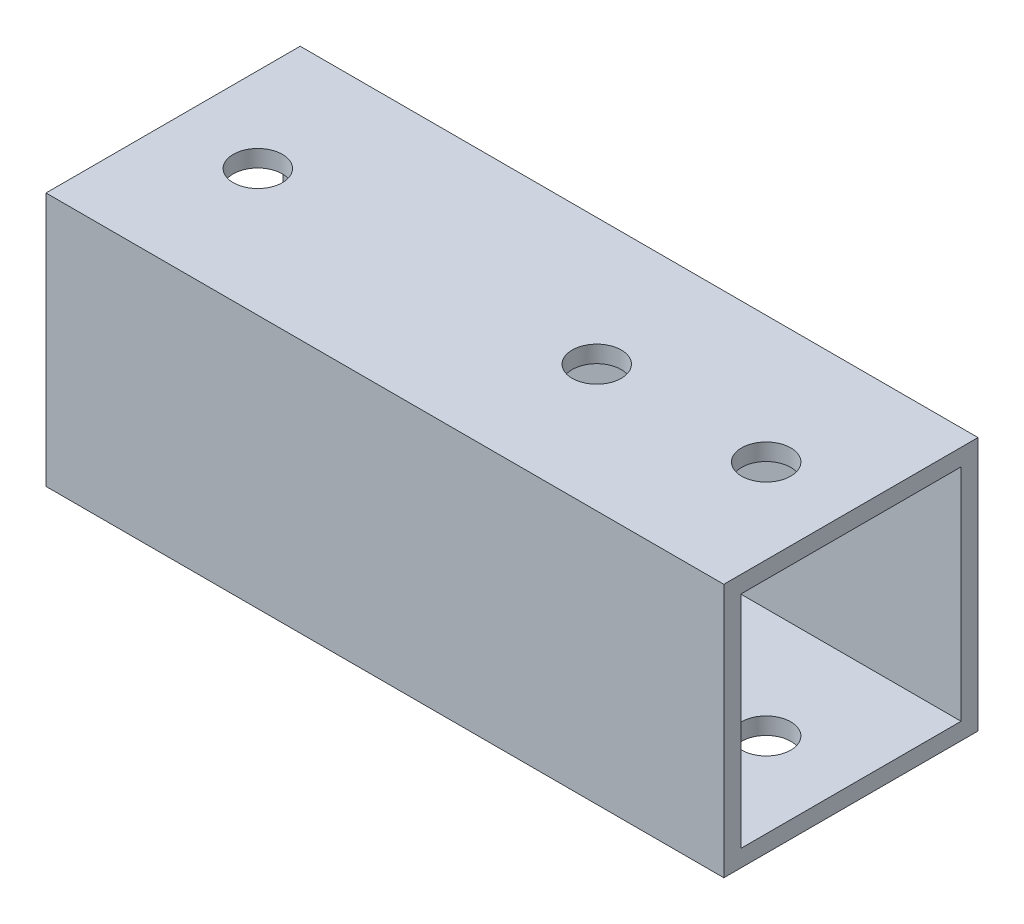
ISO-10303-21;
HEADER;
FILE_DESCRIPTION(('STEP AP214'),'2;1');
FILE_NAME('part.step','',(''),(''),'','','');
FILE_SCHEMA(('AUTOMOTIVE_DESIGN { 1 0 10303 214 1 1 1 1 }'));
ENDSEC;
DATA;
#1=APPLICATION_CONTEXT('core data for automotive mechanical design processes');
#2=APPLICATION_PROTOCOL_DEFINITION('international standard','automotive_design',2000,#1);
#3=PRODUCT_CONTEXT('',#1,'mechanical');
#4=PRODUCT('Part','Part','',(#3));
#5=PRODUCT_RELATED_PRODUCT_CATEGORY('part','',(#4));
#6=PRODUCT_DEFINITION_FORMATION('','',#4);
#7=PRODUCT_DEFINITION_CONTEXT('part definition',#1,'design');
#8=PRODUCT_DEFINITION('design','',#6,#7);
#9=PRODUCT_DEFINITION_SHAPE('','',#8);
#10=(LENGTH_UNIT() NAMED_UNIT(*) SI_UNIT(.MILLI.,.METRE.));
#11=(NAMED_UNIT(*) PLANE_ANGLE_UNIT() SI_UNIT($,.RADIAN.));
#12=(NAMED_UNIT(*) SI_UNIT($,.STERADIAN.) SOLID_ANGLE_UNIT());
#13=UNCERTAINTY_MEASURE_WITH_UNIT(LENGTH_MEASURE(1.E-05),#10,'distance_accuracy_value','');
#14=(GEOMETRIC_REPRESENTATION_CONTEXT(3) GLOBAL_UNCERTAINTY_ASSIGNED_CONTEXT((#13)) GLOBAL_UNIT_ASSIGNED_CONTEXT((#10,
#11,#12)) REPRESENTATION_CONTEXT('',''));
#15=CARTESIAN_POINT('',(0.,0.,0.));
#16=DIRECTION('',(0.,0.,1.));
#17=DIRECTION('',(1.,0.,0.));
#18=AXIS2_PLACEMENT_3D('',#15,#16,#17);
#19=CARTESIAN_POINT('',(40.,0.,0.));
#20=DIRECTION('',(-1.,0.,0.));
#21=DIRECTION('',(0.,0.,1.));
#22=AXIS2_PLACEMENT_3D('',#19,#20,#21);
#23=PLANE('',#22);
#24=DIRECTION('',(0.,1.,0.));
#25=VECTOR('',#24,1.);
#26=CARTESIAN_POINT('',(40.,-7.5,-7.5));
#27=LINE('',#26,#25);
#28=CARTESIAN_POINT('',(40.,-7.5,-7.5));
#29=VERTEX_POINT('',#28);
#30=CARTESIAN_POINT('',(40.,7.5,-7.5));
#31=VERTEX_POINT('',#30);
#32=EDGE_CURVE('E146',#29,#31,#27,.T.);
#33=ORIENTED_EDGE('',*,*,#32,.T.);
#34=DIRECTION('',(0.,0.,1.));
#35=VECTOR('',#34,1.);
#36=CARTESIAN_POINT('',(40.,7.5,7.5));
#37=LINE('',#36,#35);
#38=CARTESIAN_POINT('',(40.,7.5,7.5));
#39=VERTEX_POINT('',#38);
#40=EDGE_CURVE('E149',#31,#39,#37,.T.);
#41=ORIENTED_EDGE('',*,*,#40,.T.);
#42=DIRECTION('',(0.,-1.,0.));
#43=VECTOR('',#42,1.);
#44=CARTESIAN_POINT('',(40.,-7.5,7.5));
#45=LINE('',#44,#43);
#46=CARTESIAN_POINT('',(40.,-7.5,7.5));
#47=VERTEX_POINT('',#46);
#48=EDGE_CURVE('E152',#39,#47,#45,.T.);
#49=ORIENTED_EDGE('',*,*,#48,.T.);
#50=DIRECTION('',(0.,0.,-1.));
#51=VECTOR('',#50,1.);
#52=CARTESIAN_POINT('',(40.,-7.5,7.5));
#53=LINE('',#52,#51);
#54=EDGE_CURVE('E154',#47,#29,#53,.T.);
#55=ORIENTED_EDGE('',*,*,#54,.T.);
#56=EDGE_LOOP('',(#33,#41,#49,#55));
#57=FACE_BOUND('',#56,.T.);
#58=DIRECTION('',(0.,0.,-1.));
#59=VECTOR('',#58,1.);
#60=CARTESIAN_POINT('',(40.,-6.5,6.5));
#61=LINE('',#60,#59);
#62=CARTESIAN_POINT('',(40.,-6.5,6.5));
#63=VERTEX_POINT('',#62);
#64=CARTESIAN_POINT('',(40.,-6.5,-6.5));
#65=VERTEX_POINT('',#64);
#66=EDGE_CURVE('E108',#63,#65,#61,.T.);
#67=ORIENTED_EDGE('',*,*,#66,.F.);
#68=DIRECTION('',(0.,-1.,0.));
#69=VECTOR('',#68,1.);
#70=CARTESIAN_POINT('',(40.,-6.5,6.5));
#71=LINE('',#70,#69);
#72=CARTESIAN_POINT('',(40.,6.5,6.5));
#73=VERTEX_POINT('',#72);
#74=EDGE_CURVE('E130',#73,#63,#71,.T.);
#75=ORIENTED_EDGE('',*,*,#74,.F.);
#76=DIRECTION('',(0.,0.,1.));
#77=VECTOR('',#76,1.);
#78=CARTESIAN_POINT('',(40.,6.5,6.5));
#79=LINE('',#78,#77);
#80=CARTESIAN_POINT('',(40.,6.5,-6.5));
#81=VERTEX_POINT('',#80);
#82=EDGE_CURVE('E128',#81,#73,#79,.T.);
#83=ORIENTED_EDGE('',*,*,#82,.F.);
#84=DIRECTION('',(0.,1.,0.));
#85=VECTOR('',#84,1.);
#86=CARTESIAN_POINT('',(40.,-6.5,-6.5));
#87=LINE('',#86,#85);
#88=EDGE_CURVE('E116',#65,#81,#87,.T.);
#89=ORIENTED_EDGE('',*,*,#88,.F.);
#90=EDGE_LOOP('',(#67,#75,#83,#89));
#91=FACE_BOUND('',#90,.T.);
#92=ADVANCED_FACE('F41',(#57,#91),#23,.F.);
#93=CARTESIAN_POINT('',(0.,0.,0.));
#94=DIRECTION('',(-1.,0.,0.));
#95=DIRECTION('',(0.,0.,1.));
#96=AXIS2_PLACEMENT_3D('',#93,#94,#95);
#97=PLANE('',#96);
#98=DIRECTION('',(0.,1.,0.));
#99=VECTOR('',#98,1.);
#100=CARTESIAN_POINT('',(0.,-7.5,-7.5));
#101=LINE('',#100,#99);
#102=CARTESIAN_POINT('',(0.,-7.5,-7.5));
#103=VERTEX_POINT('',#102);
#104=CARTESIAN_POINT('',(0.,7.5,-7.5));
#105=VERTEX_POINT('',#104);
#106=EDGE_CURVE('E124',#103,#105,#101,.T.);
#107=ORIENTED_EDGE('',*,*,#106,.F.);
#108=DIRECTION('',(0.,0.,-1.));
#109=VECTOR('',#108,1.);
#110=CARTESIAN_POINT('',(0.,-7.5,7.5));
#111=LINE('',#110,#109);
#112=CARTESIAN_POINT('',(0.,-7.5,7.5));
#113=VERTEX_POINT('',#112);
#114=EDGE_CURVE('E150',#113,#103,#111,.T.);
#115=ORIENTED_EDGE('',*,*,#114,.F.);
#116=DIRECTION('',(0.,-1.,0.));
#117=VECTOR('',#116,1.);
#118=CARTESIAN_POINT('',(0.,-7.5,7.5));
#119=LINE('',#118,#117);
#120=CARTESIAN_POINT('',(0.,7.5,7.5));
#121=VERTEX_POINT('',#120);
#122=EDGE_CURVE('E161',#121,#113,#119,.T.);
#123=ORIENTED_EDGE('',*,*,#122,.F.);
#124=DIRECTION('',(0.,0.,1.));
#125=VECTOR('',#124,1.);
#126=CARTESIAN_POINT('',(0.,7.5,7.5));
#127=LINE('',#126,#125);
#128=EDGE_CURVE('E159',#105,#121,#127,.T.);
#129=ORIENTED_EDGE('',*,*,#128,.F.);
#130=EDGE_LOOP('',(#107,#115,#123,#129));
#131=FACE_BOUND('',#130,.T.);
#132=DIRECTION('',(0.,-1.,0.));
#133=VECTOR('',#132,1.);
#134=CARTESIAN_POINT('',(0.,-6.5,6.5));
#135=LINE('',#134,#133);
#136=CARTESIAN_POINT('',(0.,6.5,6.5));
#137=VERTEX_POINT('',#136);
#138=CARTESIAN_POINT('',(0.,-6.5,6.5));
#139=VERTEX_POINT('',#138);
#140=EDGE_CURVE('E117',#137,#139,#135,.T.);
#141=ORIENTED_EDGE('',*,*,#140,.T.);
#142=DIRECTION('',(0.,0.,-1.));
#143=VECTOR('',#142,1.);
#144=CARTESIAN_POINT('',(0.,-6.5,6.5));
#145=LINE('',#144,#143);
#146=CARTESIAN_POINT('',(0.,-6.5,-6.5));
#147=VERTEX_POINT('',#146);
#148=EDGE_CURVE('E66',#139,#147,#145,.T.);
#149=ORIENTED_EDGE('',*,*,#148,.T.);
#150=DIRECTION('',(0.,1.,0.));
#151=VECTOR('',#150,1.);
#152=CARTESIAN_POINT('',(0.,-6.5,-6.5));
#153=LINE('',#152,#151);
#154=CARTESIAN_POINT('',(0.,6.5,-6.5));
#155=VERTEX_POINT('',#154);
#156=EDGE_CURVE('E123',#147,#155,#153,.T.);
#157=ORIENTED_EDGE('',*,*,#156,.T.);
#158=DIRECTION('',(0.,0.,1.));
#159=VECTOR('',#158,1.);
#160=CARTESIAN_POINT('',(0.,6.5,6.5));
#161=LINE('',#160,#159);
#162=EDGE_CURVE('E138',#155,#137,#161,.T.);
#163=ORIENTED_EDGE('',*,*,#162,.T.);
#164=EDGE_LOOP('',(#141,#149,#157,#163));
#165=FACE_BOUND('',#164,.T.);
#166=ADVANCED_FACE('F208',(#131,#165),#97,.T.);
#167=CARTESIAN_POINT('',(40.,-7.5,-7.5));
#168=DIRECTION('',(0.,0.,1.));
#169=DIRECTION('',(1.,0.,0.));
#170=AXIS2_PLACEMENT_3D('',#167,#168,#169);
#171=PLANE('',#170);
#172=ORIENTED_EDGE('',*,*,#106,.T.);
#173=DIRECTION('',(-1.,0.,0.));
#174=VECTOR('',#173,1.);
#175=CARTESIAN_POINT('',(40.,7.5,-7.5));
#176=LINE('',#175,#174);
#177=EDGE_CURVE('E11',#31,#105,#176,.T.);
#178=ORIENTED_EDGE('',*,*,#177,.F.);
#179=ORIENTED_EDGE('',*,*,#32,.F.);
#180=DIRECTION('',(-1.,0.,0.));
#181=VECTOR('',#180,1.);
#182=CARTESIAN_POINT('',(40.,-7.5,-7.5));
#183=LINE('',#182,#181);
#184=EDGE_CURVE('E156',#29,#103,#183,.T.);
#185=ORIENTED_EDGE('',*,*,#184,.T.);
#186=EDGE_LOOP('',(#172,#178,#179,#185));
#187=FACE_BOUND('',#186,.T.);
#188=ADVANCED_FACE('F43',(#187),#171,.F.);
#189=CARTESIAN_POINT('',(40.,7.5,7.5));
#190=DIRECTION('',(0.,-1.,0.));
#191=DIRECTION('',(0.,0.,-1.));
#192=AXIS2_PLACEMENT_3D('',#189,#190,#191);
#193=PLANE('',#192);
#194=CARTESIAN_POINT('',(4.99999999999814,7.5,0.));
#195=DIRECTION('',(0.,1.,0.));
#196=DIRECTION('',(0.,0.,1.));
#197=AXIS2_PLACEMENT_3D('',#194,#195,#196);
#198=CIRCLE('',#197,1.45000000000001);
#199=CARTESIAN_POINT('',(4.99999999999814,7.5,1.44999999999995));
#200=VERTEX_POINT('',#199);
#201=EDGE_CURVE('E248',#200,#200,#198,.T.);
#202=ORIENTED_EDGE('',*,*,#201,.F.);
#203=EDGE_LOOP('',(#202));
#204=FACE_BOUND('',#203,.T.);
#205=CARTESIAN_POINT('',(24.9999999999981,7.5,0.));
#206=DIRECTION('',(0.,1.,0.));
#207=DIRECTION('',(0.,0.,1.));
#208=AXIS2_PLACEMENT_3D('',#205,#206,#207);
#209=CIRCLE('',#208,1.45000000000001);
#210=CARTESIAN_POINT('',(24.9999999999981,7.5,1.44999999999995));
#211=VERTEX_POINT('',#210);
#212=EDGE_CURVE('E252',#211,#211,#209,.T.);
#213=ORIENTED_EDGE('',*,*,#212,.F.);
#214=EDGE_LOOP('',(#213));
#215=FACE_BOUND('',#214,.T.);
#216=CARTESIAN_POINT('',(34.9999999999981,7.5,0.));
#217=DIRECTION('',(0.,1.,0.));
#218=DIRECTION('',(0.,0.,1.));
#219=AXIS2_PLACEMENT_3D('',#216,#217,#218);
#220=CIRCLE('',#219,1.45000000000001);
#221=CARTESIAN_POINT('',(34.9999999999981,7.5,1.44999999999995));
#222=VERTEX_POINT('',#221);
#223=EDGE_CURVE('E256',#222,#222,#220,.T.);
#224=ORIENTED_EDGE('',*,*,#223,.F.);
#225=EDGE_LOOP('',(#224));
#226=FACE_BOUND('',#225,.T.);
#227=ORIENTED_EDGE('',*,*,#128,.T.);
#228=DIRECTION('',(-1.,0.,0.));
#229=VECTOR('',#228,1.);
#230=CARTESIAN_POINT('',(40.,7.5,7.5));
#231=LINE('',#230,#229);
#232=EDGE_CURVE('E50',#39,#121,#231,.T.);
#233=ORIENTED_EDGE('',*,*,#232,.F.);
#234=ORIENTED_EDGE('',*,*,#40,.F.);
#235=ORIENTED_EDGE('',*,*,#177,.T.);
#236=EDGE_LOOP('',(#227,#233,#234,#235));
#237=FACE_BOUND('',#236,.T.);
#238=ADVANCED_FACE('F238',(#204,#215,#226,#237),#193,.F.);
#239=CARTESIAN_POINT('',(40.,-7.5,7.5));
#240=DIRECTION('',(0.,0.,-1.));
#241=DIRECTION('',(-1.,0.,0.));
#242=AXIS2_PLACEMENT_3D('',#239,#240,#241);
#243=PLANE('',#242);
#244=ORIENTED_EDGE('',*,*,#122,.T.);
#245=DIRECTION('',(-1.,0.,0.));
#246=VECTOR('',#245,1.);
#247=CARTESIAN_POINT('',(40.,-7.5,7.5));
#248=LINE('',#247,#246);
#249=EDGE_CURVE('E166',#47,#113,#248,.T.);
#250=ORIENTED_EDGE('',*,*,#249,.F.);
#251=ORIENTED_EDGE('',*,*,#48,.F.);
#252=ORIENTED_EDGE('',*,*,#232,.T.);
#253=EDGE_LOOP('',(#244,#250,#251,#252));
#254=FACE_BOUND('',#253,.T.);
#255=ADVANCED_FACE('F235',(#254),#243,.F.);
#256=CARTESIAN_POINT('',(40.,-7.5,7.5));
#257=DIRECTION('',(0.,1.,0.));
#258=DIRECTION('',(0.,0.,1.));
#259=AXIS2_PLACEMENT_3D('',#256,#257,#258);
#260=PLANE('',#259);
#261=CARTESIAN_POINT('',(4.99999999999814,-7.5,0.));
#262=DIRECTION('',(0.,1.,0.));
#263=DIRECTION('',(0.,0.,1.));
#264=AXIS2_PLACEMENT_3D('',#261,#262,#263);
#265=CIRCLE('',#264,1.45000000000001);
#266=CARTESIAN_POINT('',(4.99999999999814,-7.5,1.44999999999995));
#267=VERTEX_POINT('',#266);
#268=EDGE_CURVE('E174',#267,#267,#265,.T.);
#269=ORIENTED_EDGE('',*,*,#268,.T.);
#270=EDGE_LOOP('',(#269));
#271=FACE_BOUND('',#270,.T.);
#272=CARTESIAN_POINT('',(24.9999999999981,-7.5,0.));
#273=DIRECTION('',(0.,1.,0.));
#274=DIRECTION('',(0.,0.,1.));
#275=AXIS2_PLACEMENT_3D('',#272,#273,#274);
#276=CIRCLE('',#275,1.45000000000001);
#277=CARTESIAN_POINT('',(24.9999999999981,-7.5,1.44999999999995));
#278=VERTEX_POINT('',#277);
#279=EDGE_CURVE('E269',#278,#278,#276,.T.);
#280=ORIENTED_EDGE('',*,*,#279,.T.);
#281=EDGE_LOOP('',(#280));
#282=FACE_BOUND('',#281,.T.);
#283=CARTESIAN_POINT('',(34.9999999999981,-7.5,0.));
#284=DIRECTION('',(0.,1.,0.));
#285=DIRECTION('',(0.,0.,1.));
#286=AXIS2_PLACEMENT_3D('',#283,#284,#285);
#287=CIRCLE('',#286,1.45000000000001);
#288=CARTESIAN_POINT('',(34.9999999999981,-7.5,1.44999999999995));
#289=VERTEX_POINT('',#288);
#290=EDGE_CURVE('E187',#289,#289,#287,.T.);
#291=ORIENTED_EDGE('',*,*,#290,.T.);
#292=EDGE_LOOP('',(#291));
#293=FACE_BOUND('',#292,.T.);
#294=ORIENTED_EDGE('',*,*,#114,.T.);
#295=ORIENTED_EDGE('',*,*,#184,.F.);
#296=ORIENTED_EDGE('',*,*,#54,.F.);
#297=ORIENTED_EDGE('',*,*,#249,.T.);
#298=EDGE_LOOP('',(#294,#295,#296,#297));
#299=FACE_BOUND('',#298,.T.);
#300=ADVANCED_FACE('F232',(#271,#282,#293,#299),#260,.F.);
#301=CARTESIAN_POINT('',(40.,-6.5,6.5));
#302=DIRECTION('',(0.,1.,0.));
#303=DIRECTION('',(0.,0.,1.));
#304=AXIS2_PLACEMENT_3D('',#301,#302,#303);
#305=PLANE('',#304);
#306=CARTESIAN_POINT('',(4.99999999999814,-6.5,0.));
#307=DIRECTION('',(0.,1.,0.));
#308=DIRECTION('',(0.,0.,1.));
#309=AXIS2_PLACEMENT_3D('',#306,#307,#308);
#310=CIRCLE('',#309,1.45000000000001);
#311=CARTESIAN_POINT('',(4.99999999999814,-6.5,1.44999999999995));
#312=VERTEX_POINT('',#311);
#313=EDGE_CURVE('E136',#312,#312,#310,.T.);
#314=ORIENTED_EDGE('',*,*,#313,.F.);
#315=EDGE_LOOP('',(#314));
#316=FACE_BOUND('',#315,.T.);
#317=CARTESIAN_POINT('',(24.9999999999981,-6.5,0.));
#318=DIRECTION('',(0.,1.,0.));
#319=DIRECTION('',(0.,0.,1.));
#320=AXIS2_PLACEMENT_3D('',#317,#318,#319);
#321=CIRCLE('',#320,1.45000000000001);
#322=CARTESIAN_POINT('',(24.9999999999981,-6.5,1.44999999999995));
#323=VERTEX_POINT('',#322);
#324=EDGE_CURVE('E177',#323,#323,#321,.T.);
#325=ORIENTED_EDGE('',*,*,#324,.F.);
#326=EDGE_LOOP('',(#325));
#327=FACE_BOUND('',#326,.T.);
#328=CARTESIAN_POINT('',(34.9999999999981,-6.5,0.));
#329=DIRECTION('',(0.,1.,0.));
#330=DIRECTION('',(0.,0.,1.));
#331=AXIS2_PLACEMENT_3D('',#328,#329,#330);
#332=CIRCLE('',#331,1.45000000000001);
#333=CARTESIAN_POINT('',(34.9999999999981,-6.5,1.44999999999995));
#334=VERTEX_POINT('',#333);
#335=EDGE_CURVE('E173',#334,#334,#332,.T.);
#336=ORIENTED_EDGE('',*,*,#335,.F.);
#337=EDGE_LOOP('',(#336));
#338=FACE_BOUND('',#337,.T.);
#339=ORIENTED_EDGE('',*,*,#148,.F.);
#340=DIRECTION('',(-1.,0.,0.));
#341=VECTOR('',#340,1.);
#342=CARTESIAN_POINT('',(40.,-6.5,6.5));
#343=LINE('',#342,#341);
#344=EDGE_CURVE('E112',#63,#139,#343,.T.);
#345=ORIENTED_EDGE('',*,*,#344,.F.);
#346=ORIENTED_EDGE('',*,*,#66,.T.);
#347=DIRECTION('',(-1.,0.,0.));
#348=VECTOR('',#347,1.);
#349=CARTESIAN_POINT('',(40.,-6.5,-6.5));
#350=LINE('',#349,#348);
#351=EDGE_CURVE('E111',#65,#147,#350,.T.);
#352=ORIENTED_EDGE('',*,*,#351,.T.);
#353=EDGE_LOOP('',(#339,#345,#346,#352));
#354=FACE_BOUND('',#353,.T.);
#355=ADVANCED_FACE('F110',(#316,#327,#338,#354),#305,.T.);
#356=CARTESIAN_POINT('',(40.,-6.5,-6.5));
#357=DIRECTION('',(0.,0.,1.));
#358=DIRECTION('',(0.,-1.,0.));
#359=AXIS2_PLACEMENT_3D('',#356,#357,#358);
#360=PLANE('',#359);
#361=ORIENTED_EDGE('',*,*,#156,.F.);
#362=ORIENTED_EDGE('',*,*,#351,.F.);
#363=ORIENTED_EDGE('',*,*,#88,.T.);
#364=DIRECTION('',(-1.,0.,0.));
#365=VECTOR('',#364,1.);
#366=CARTESIAN_POINT('',(40.,6.5,-6.5));
#367=LINE('',#366,#365);
#368=EDGE_CURVE('E125',#81,#155,#367,.T.);
#369=ORIENTED_EDGE('',*,*,#368,.T.);
#370=EDGE_LOOP('',(#361,#362,#363,#369));
#371=FACE_BOUND('',#370,.T.);
#372=ADVANCED_FACE('F120',(#371),#360,.T.);
#373=CARTESIAN_POINT('',(40.,6.5,6.5));
#374=DIRECTION('',(0.,-1.,0.));
#375=DIRECTION('',(0.,0.,-1.));
#376=AXIS2_PLACEMENT_3D('',#373,#374,#375);
#377=PLANE('',#376);
#378=CARTESIAN_POINT('',(4.99999999999814,6.5,0.));
#379=DIRECTION('',(0.,-1.,0.));
#380=DIRECTION('',(0.,0.,-1.));
#381=AXIS2_PLACEMENT_3D('',#378,#379,#380);
#382=CIRCLE('',#381,1.45000000000001);
#383=CARTESIAN_POINT('',(4.99999999999814,6.5,-1.45000000000006));
#384=VERTEX_POINT('',#383);
#385=EDGE_CURVE('E45',#384,#384,#382,.T.);
#386=ORIENTED_EDGE('',*,*,#385,.F.);
#387=EDGE_LOOP('',(#386));
#388=FACE_BOUND('',#387,.T.);
#389=CARTESIAN_POINT('',(24.9999999999981,6.5,0.));
#390=DIRECTION('',(0.,-1.,0.));
#391=DIRECTION('',(0.,0.,-1.));
#392=AXIS2_PLACEMENT_3D('',#389,#390,#391);
#393=CIRCLE('',#392,1.45000000000001);
#394=CARTESIAN_POINT('',(24.9999999999981,6.5,-1.45000000000006));
#395=VERTEX_POINT('',#394);
#396=EDGE_CURVE('E175',#395,#395,#393,.T.);
#397=ORIENTED_EDGE('',*,*,#396,.F.);
#398=EDGE_LOOP('',(#397));
#399=FACE_BOUND('',#398,.T.);
#400=CARTESIAN_POINT('',(34.9999999999981,6.5,0.));
#401=DIRECTION('',(0.,-1.,0.));
#402=DIRECTION('',(0.,0.,-1.));
#403=AXIS2_PLACEMENT_3D('',#400,#401,#402);
#404=CIRCLE('',#403,1.45000000000001);
#405=CARTESIAN_POINT('',(34.9999999999981,6.5,-1.45000000000006));
#406=VERTEX_POINT('',#405);
#407=EDGE_CURVE('E171',#406,#406,#404,.T.);
#408=ORIENTED_EDGE('',*,*,#407,.F.);
#409=EDGE_LOOP('',(#408));
#410=FACE_BOUND('',#409,.T.);
#411=ORIENTED_EDGE('',*,*,#162,.F.);
#412=ORIENTED_EDGE('',*,*,#368,.F.);
#413=ORIENTED_EDGE('',*,*,#82,.T.);
#414=DIRECTION('',(-1.,0.,0.));
#415=VECTOR('',#414,1.);
#416=CARTESIAN_POINT('',(40.,6.5,6.5));
#417=LINE('',#416,#415);
#418=EDGE_CURVE('E58',#73,#137,#417,.T.);
#419=ORIENTED_EDGE('',*,*,#418,.T.);
#420=EDGE_LOOP('',(#411,#412,#413,#419));
#421=FACE_BOUND('',#420,.T.);
#422=ADVANCED_FACE('F198',(#388,#399,#410,#421),#377,.T.);
#423=CARTESIAN_POINT('',(40.,-6.5,6.5));
#424=DIRECTION('',(0.,0.,-1.));
#425=DIRECTION('',(-1.,0.,0.));
#426=AXIS2_PLACEMENT_3D('',#423,#424,#425);
#427=PLANE('',#426);
#428=ORIENTED_EDGE('',*,*,#140,.F.);
#429=ORIENTED_EDGE('',*,*,#418,.F.);
#430=ORIENTED_EDGE('',*,*,#74,.T.);
#431=ORIENTED_EDGE('',*,*,#344,.T.);
#432=EDGE_LOOP('',(#428,#429,#430,#431));
#433=FACE_BOUND('',#432,.T.);
#434=ADVANCED_FACE('F201',(#433),#427,.T.);
#435=CARTESIAN_POINT('',(34.9999999999981,-7.5,0.));
#436=DIRECTION('',(0.,1.,0.));
#437=DIRECTION('',(0.,0.,1.));
#438=AXIS2_PLACEMENT_3D('',#435,#436,#437);
#439=CYLINDRICAL_SURFACE('',#438,1.45000000000001);
#440=ORIENTED_EDGE('',*,*,#407,.T.);
#441=EDGE_LOOP('',(#440));
#442=FACE_BOUND('',#441,.T.);
#443=ORIENTED_EDGE('',*,*,#223,.T.);
#444=EDGE_LOOP('',(#443));
#445=FACE_BOUND('',#444,.T.);
#446=ADVANCED_FACE('F210',(#442,#445),#439,.F.);
#447=CARTESIAN_POINT('',(24.9999999999981,-7.5,0.));
#448=DIRECTION('',(0.,1.,0.));
#449=DIRECTION('',(0.,0.,1.));
#450=AXIS2_PLACEMENT_3D('',#447,#448,#449);
#451=CYLINDRICAL_SURFACE('',#450,1.45000000000001);
#452=ORIENTED_EDGE('',*,*,#396,.T.);
#453=EDGE_LOOP('',(#452));
#454=FACE_BOUND('',#453,.T.);
#455=ORIENTED_EDGE('',*,*,#212,.T.);
#456=EDGE_LOOP('',(#455));
#457=FACE_BOUND('',#456,.T.);
#458=ADVANCED_FACE('F217',(#454,#457),#451,.F.);
#459=CARTESIAN_POINT('',(4.99999999999814,-7.5,0.));
#460=DIRECTION('',(0.,1.,0.));
#461=DIRECTION('',(0.,0.,1.));
#462=AXIS2_PLACEMENT_3D('',#459,#460,#461);
#463=CYLINDRICAL_SURFACE('',#462,1.45000000000001);
#464=ORIENTED_EDGE('',*,*,#385,.T.);
#465=EDGE_LOOP('',(#464));
#466=FACE_BOUND('',#465,.T.);
#467=ORIENTED_EDGE('',*,*,#201,.T.);
#468=EDGE_LOOP('',(#467));
#469=FACE_BOUND('',#468,.T.);
#470=ADVANCED_FACE('F195',(#466,#469),#463,.F.);
#471=ORIENTED_EDGE('',*,*,#335,.T.);
#472=EDGE_LOOP('',(#471));
#473=FACE_BOUND('',#472,.T.);
#474=ORIENTED_EDGE('',*,*,#290,.F.);
#475=EDGE_LOOP('',(#474));
#476=FACE_BOUND('',#475,.T.);
#477=ADVANCED_FACE('F220',(#473,#476),#439,.F.);
#478=ORIENTED_EDGE('',*,*,#324,.T.);
#479=EDGE_LOOP('',(#478));
#480=FACE_BOUND('',#479,.T.);
#481=ORIENTED_EDGE('',*,*,#279,.F.);
#482=EDGE_LOOP('',(#481));
#483=FACE_BOUND('',#482,.T.);
#484=ADVANCED_FACE('F282',(#480,#483),#451,.F.);
#485=ORIENTED_EDGE('',*,*,#313,.T.);
#486=EDGE_LOOP('',(#485));
#487=FACE_BOUND('',#486,.T.);
#488=ORIENTED_EDGE('',*,*,#268,.F.);
#489=EDGE_LOOP('',(#488));
#490=FACE_BOUND('',#489,.T.);
#491=ADVANCED_FACE('F280',(#487,#490),#463,.F.);
#492=CLOSED_SHELL('',(#92,#166,#188,#238,#255,#300,#355,#372,#422,#434,#446,#458,#470,#477,#484,#491));
#493=MANIFOLD_SOLID_BREP('B2',#492);
#494=ADVANCED_BREP_SHAPE_REPRESENTATION('',(#18,#493),#14);
#495=SHAPE_DEFINITION_REPRESENTATION(#9,#494);
ENDSEC;
END-ISO-10303-21;
